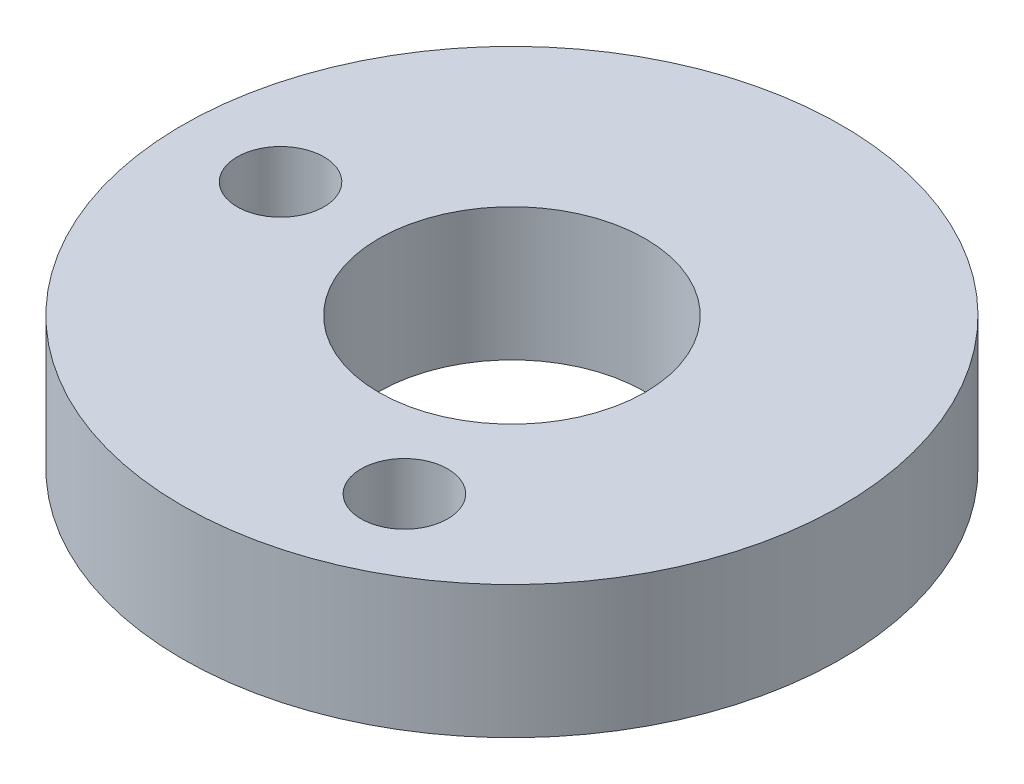
ISO-10303-21;
HEADER;
FILE_DESCRIPTION(('STEP AP214'),'2;1');
FILE_NAME('part.step','',(''),(''),'','','');
FILE_SCHEMA(('AUTOMOTIVE_DESIGN { 1 0 10303 214 1 1 1 1 }'));
ENDSEC;
DATA;
#1=APPLICATION_CONTEXT('core data for automotive mechanical design processes');
#2=APPLICATION_PROTOCOL_DEFINITION('international standard','automotive_design',2000,#1);
#3=PRODUCT_CONTEXT('',#1,'mechanical');
#4=PRODUCT('Part','Part','',(#3));
#5=PRODUCT_RELATED_PRODUCT_CATEGORY('part','',(#4));
#6=PRODUCT_DEFINITION_FORMATION('','',#4);
#7=PRODUCT_DEFINITION_CONTEXT('part definition',#1,'design');
#8=PRODUCT_DEFINITION('design','',#6,#7);
#9=PRODUCT_DEFINITION_SHAPE('','',#8);
#10=(LENGTH_UNIT() NAMED_UNIT(*) SI_UNIT(.MILLI.,.METRE.));
#11=(NAMED_UNIT(*) PLANE_ANGLE_UNIT() SI_UNIT($,.RADIAN.));
#12=(NAMED_UNIT(*) SI_UNIT($,.STERADIAN.) SOLID_ANGLE_UNIT());
#13=UNCERTAINTY_MEASURE_WITH_UNIT(LENGTH_MEASURE(1.E-05),#10,'distance_accuracy_value','');
#14=(GEOMETRIC_REPRESENTATION_CONTEXT(3) GLOBAL_UNCERTAINTY_ASSIGNED_CONTEXT((#13)) GLOBAL_UNIT_ASSIGNED_CONTEXT((#10,
#11,#12)) REPRESENTATION_CONTEXT('',''));
#15=CARTESIAN_POINT('',(0.,0.,0.));
#16=DIRECTION('',(0.,0.,1.));
#17=DIRECTION('',(1.,0.,0.));
#18=AXIS2_PLACEMENT_3D('',#15,#16,#17);
#19=CARTESIAN_POINT('',(0.,12.7,0.));
#20=DIRECTION('',(0.,1.,0.));
#21=DIRECTION('',(0.,0.,1.));
#22=AXIS2_PLACEMENT_3D('',#19,#20,#21);
#23=PLANE('',#22);
#24=CARTESIAN_POINT('',(-22.15,12.7,0.));
#25=DIRECTION('',(0.,-1.,0.));
#26=DIRECTION('',(0.,0.,-1.));
#27=AXIS2_PLACEMENT_3D('',#24,#25,#26);
#28=CIRCLE('',#27,4.15);
#29=CARTESIAN_POINT('',(-22.15,12.7,-4.15000000000001));
#30=VERTEX_POINT('',#29);
#31=EDGE_CURVE('E62',#30,#30,#28,.T.);
#32=ORIENTED_EDGE('',*,*,#31,.T.);
#33=EDGE_LOOP('',(#32));
#34=FACE_BOUND('',#33,.T.);
#35=CARTESIAN_POINT('',(9.64460270880362,12.7,19.9400135052446));
#36=DIRECTION('',(0.,-1.,0.));
#37=DIRECTION('',(0.,0.,-1.));
#38=AXIS2_PLACEMENT_3D('',#35,#36,#37);
#39=CIRCLE('',#38,4.15);
#40=CARTESIAN_POINT('',(9.64460270880362,12.7,15.7900135052446));
#41=VERTEX_POINT('',#40);
#42=EDGE_CURVE('E66',#41,#41,#39,.T.);
#43=ORIENTED_EDGE('',*,*,#42,.T.);
#44=EDGE_LOOP('',(#43));
#45=FACE_BOUND('',#44,.T.);
#46=CARTESIAN_POINT('',(0.,12.7,0.));
#47=DIRECTION('',(0.,1.,0.));
#48=DIRECTION('',(0.,0.,1.));
#49=AXIS2_PLACEMENT_3D('',#46,#47,#48);
#50=CIRCLE('',#49,31.55);
#51=CARTESIAN_POINT('',(0.,12.7,31.55));
#52=VERTEX_POINT('',#51);
#53=EDGE_CURVE('E10',#52,#52,#50,.T.);
#54=ORIENTED_EDGE('',*,*,#53,.T.);
#55=EDGE_LOOP('',(#54));
#56=FACE_BOUND('',#55,.T.);
#57=CARTESIAN_POINT('',(0.,12.7,0.));
#58=DIRECTION('',(0.,1.,0.));
#59=DIRECTION('',(0.,0.,1.));
#60=AXIS2_PLACEMENT_3D('',#57,#58,#59);
#61=CIRCLE('',#60,12.75);
#62=CARTESIAN_POINT('',(0.,12.7,12.75));
#63=VERTEX_POINT('',#62);
#64=EDGE_CURVE('E56',#63,#63,#61,.T.);
#65=ORIENTED_EDGE('',*,*,#64,.F.);
#66=EDGE_LOOP('',(#65));
#67=FACE_BOUND('',#66,.T.);
#68=ADVANCED_FACE('F41',(#34,#45,#56,#67),#23,.T.);
#69=CARTESIAN_POINT('',(0.,0.,0.));
#70=DIRECTION('',(0.,1.,0.));
#71=DIRECTION('',(0.,0.,1.));
#72=AXIS2_PLACEMENT_3D('',#69,#70,#71);
#73=PLANE('',#72);
#74=CARTESIAN_POINT('',(-22.15,0.,0.));
#75=DIRECTION('',(0.,-1.,0.));
#76=DIRECTION('',(0.,0.,-1.));
#77=AXIS2_PLACEMENT_3D('',#74,#75,#76);
#78=CIRCLE('',#77,4.15);
#79=CARTESIAN_POINT('',(-22.15,0.,-4.15000000000001));
#80=VERTEX_POINT('',#79);
#81=EDGE_CURVE('E73',#80,#80,#78,.T.);
#82=ORIENTED_EDGE('',*,*,#81,.F.);
#83=EDGE_LOOP('',(#82));
#84=FACE_BOUND('',#83,.T.);
#85=CARTESIAN_POINT('',(9.64460270880362,0.,19.9400135052446));
#86=DIRECTION('',(0.,-1.,0.));
#87=DIRECTION('',(0.,0.,-1.));
#88=AXIS2_PLACEMENT_3D('',#85,#86,#87);
#89=CIRCLE('',#88,4.15);
#90=CARTESIAN_POINT('',(9.64460270880362,0.,15.7900135052446));
#91=VERTEX_POINT('',#90);
#92=EDGE_CURVE('E70',#91,#91,#89,.T.);
#93=ORIENTED_EDGE('',*,*,#92,.F.);
#94=EDGE_LOOP('',(#93));
#95=FACE_BOUND('',#94,.T.);
#96=CARTESIAN_POINT('',(0.,0.,0.));
#97=DIRECTION('',(0.,1.,0.));
#98=DIRECTION('',(0.,0.,1.));
#99=AXIS2_PLACEMENT_3D('',#96,#97,#98);
#100=CIRCLE('',#99,31.55);
#101=CARTESIAN_POINT('',(0.,0.,31.55));
#102=VERTEX_POINT('',#101);
#103=EDGE_CURVE('E45',#102,#102,#100,.T.);
#104=ORIENTED_EDGE('',*,*,#103,.F.);
#105=EDGE_LOOP('',(#104));
#106=FACE_BOUND('',#105,.T.);
#107=CARTESIAN_POINT('',(0.,0.,0.));
#108=DIRECTION('',(0.,1.,0.));
#109=DIRECTION('',(0.,0.,1.));
#110=AXIS2_PLACEMENT_3D('',#107,#108,#109);
#111=CIRCLE('',#110,12.75);
#112=CARTESIAN_POINT('',(0.,0.,12.75));
#113=VERTEX_POINT('',#112);
#114=EDGE_CURVE('E58',#113,#113,#111,.T.);
#115=ORIENTED_EDGE('',*,*,#114,.T.);
#116=EDGE_LOOP('',(#115));
#117=FACE_BOUND('',#116,.T.);
#118=ADVANCED_FACE('F89',(#84,#95,#106,#117),#73,.F.);
#119=CARTESIAN_POINT('',(0.,12.7,0.));
#120=DIRECTION('',(0.,-1.,0.));
#121=DIRECTION('',(0.,0.,-1.));
#122=AXIS2_PLACEMENT_3D('',#119,#120,#121);
#123=CYLINDRICAL_SURFACE('',#122,31.55);
#124=ORIENTED_EDGE('',*,*,#53,.F.);
#125=EDGE_LOOP('',(#124));
#126=FACE_BOUND('',#125,.T.);
#127=ORIENTED_EDGE('',*,*,#103,.T.);
#128=EDGE_LOOP('',(#127));
#129=FACE_BOUND('',#128,.T.);
#130=ADVANCED_FACE('F43',(#126,#129),#123,.T.);
#131=CARTESIAN_POINT('',(0.,12.7,0.));
#132=DIRECTION('',(0.,-1.,0.));
#133=DIRECTION('',(0.,0.,-1.));
#134=AXIS2_PLACEMENT_3D('',#131,#132,#133);
#135=CYLINDRICAL_SURFACE('',#134,12.75);
#136=ORIENTED_EDGE('',*,*,#64,.T.);
#137=EDGE_LOOP('',(#136));
#138=FACE_BOUND('',#137,.T.);
#139=ORIENTED_EDGE('',*,*,#114,.F.);
#140=EDGE_LOOP('',(#139));
#141=FACE_BOUND('',#140,.T.);
#142=ADVANCED_FACE('F98',(#138,#141),#135,.F.);
#143=CARTESIAN_POINT('',(9.64460270880362,12.7,19.9400135052446));
#144=DIRECTION('',(0.,-1.,0.));
#145=DIRECTION('',(0.,0.,-1.));
#146=AXIS2_PLACEMENT_3D('',#143,#144,#145);
#147=CYLINDRICAL_SURFACE('',#146,4.15);
#148=ORIENTED_EDGE('',*,*,#42,.F.);
#149=EDGE_LOOP('',(#148));
#150=FACE_BOUND('',#149,.T.);
#151=ORIENTED_EDGE('',*,*,#92,.T.);
#152=EDGE_LOOP('',(#151));
#153=FACE_BOUND('',#152,.T.);
#154=ADVANCED_FACE('F85',(#150,#153),#147,.F.);
#155=CARTESIAN_POINT('',(-22.15,12.7,0.));
#156=DIRECTION('',(0.,-1.,0.));
#157=DIRECTION('',(0.,0.,-1.));
#158=AXIS2_PLACEMENT_3D('',#155,#156,#157);
#159=CYLINDRICAL_SURFACE('',#158,4.15);
#160=ORIENTED_EDGE('',*,*,#31,.F.);
#161=EDGE_LOOP('',(#160));
#162=FACE_BOUND('',#161,.T.);
#163=ORIENTED_EDGE('',*,*,#81,.T.);
#164=EDGE_LOOP('',(#163));
#165=FACE_BOUND('',#164,.T.);
#166=ADVANCED_FACE('F82',(#162,#165),#159,.F.);
#167=CLOSED_SHELL('',(#68,#118,#130,#142,#154,#166));
#168=MANIFOLD_SOLID_BREP('B2',#167);
#169=ADVANCED_BREP_SHAPE_REPRESENTATION('',(#18,#168),#14);
#170=SHAPE_DEFINITION_REPRESENTATION(#9,#169);
ENDSEC;
END-ISO-10303-21;
